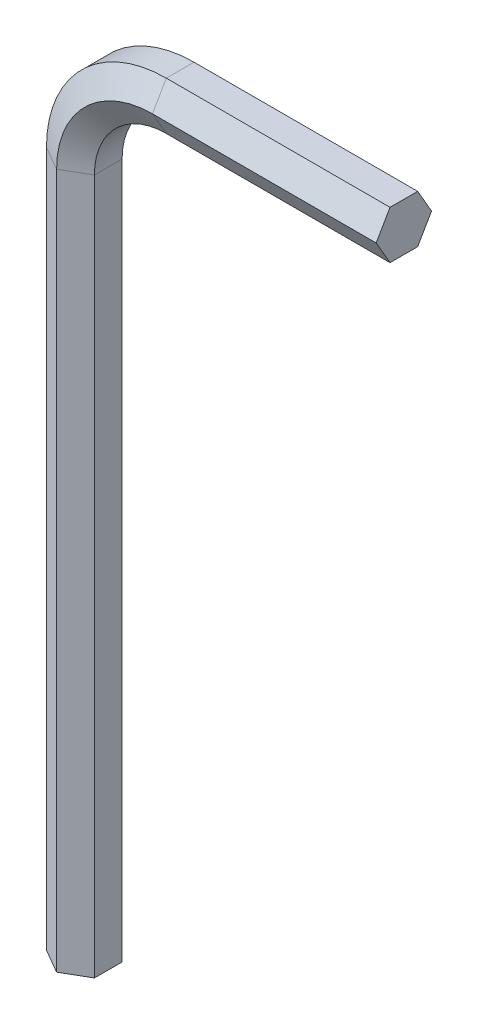
ISO-10303-21;
HEADER;
FILE_DESCRIPTION(('STEP AP214'),'2;1');
FILE_NAME('part.step','',(''),(''),'','','');
FILE_SCHEMA(('AUTOMOTIVE_DESIGN { 1 0 10303 214 1 1 1 1 }'));
ENDSEC;
DATA;
#1=APPLICATION_CONTEXT('core data for automotive mechanical design processes');
#2=APPLICATION_PROTOCOL_DEFINITION('international standard','automotive_design',2000,#1);
#3=PRODUCT_CONTEXT('',#1,'mechanical');
#4=PRODUCT('Part','Part','',(#3));
#5=PRODUCT_RELATED_PRODUCT_CATEGORY('part','',(#4));
#6=PRODUCT_DEFINITION_FORMATION('','',#4);
#7=PRODUCT_DEFINITION_CONTEXT('part definition',#1,'design');
#8=PRODUCT_DEFINITION('design','',#6,#7);
#9=PRODUCT_DEFINITION_SHAPE('','',#8);
#10=(LENGTH_UNIT() NAMED_UNIT(*) SI_UNIT(.MILLI.,.METRE.));
#11=(NAMED_UNIT(*) PLANE_ANGLE_UNIT() SI_UNIT($,.RADIAN.));
#12=(NAMED_UNIT(*) SI_UNIT($,.STERADIAN.) SOLID_ANGLE_UNIT());
#13=UNCERTAINTY_MEASURE_WITH_UNIT(LENGTH_MEASURE(1.E-05),#10,'distance_accuracy_value','');
#14=(GEOMETRIC_REPRESENTATION_CONTEXT(3) GLOBAL_UNCERTAINTY_ASSIGNED_CONTEXT((#13)) GLOBAL_UNIT_ASSIGNED_CONTEXT((#10,
#11,#12)) REPRESENTATION_CONTEXT('',''));
#15=CARTESIAN_POINT('',(0.,0.,0.));
#16=DIRECTION('',(0.,0.,1.));
#17=DIRECTION('',(1.,0.,0.));
#18=AXIS2_PLACEMENT_3D('',#15,#16,#17);
#19=CARTESIAN_POINT('',(-5.75291016450414,0.,0.));
#20=DIRECTION('',(1.,0.,0.));
#21=DIRECTION('',(0.,0.,1.));
#22=AXIS2_PLACEMENT_3D('',#19,#20,#21);
#23=PLANE('',#22);
#24=DIRECTION('',(0.,0.866025403784439,-0.5));
#25=VECTOR('',#24,1.);
#26=CARTESIAN_POINT('',(-5.75291016450414,29.2479101645041,-1.09985226280624));
#27=LINE('',#26,#25);
#28=CARTESIAN_POINT('',(-5.75291016450414,29.2479101645041,-1.09985226280624));
#29=VERTEX_POINT('',#28);
#30=CARTESIAN_POINT('',(-5.75291016450414,31.1529101645041,-2.19970452561248));
#31=VERTEX_POINT('',#30);
#32=EDGE_CURVE('E189',#29,#31,#27,.T.);
#33=ORIENTED_EDGE('',*,*,#32,.T.);
#34=DIRECTION('',(0.,0.866025403784439,0.5));
#35=VECTOR('',#34,1.);
#36=CARTESIAN_POINT('',(-5.75291016450414,31.1529101645041,-2.19970452561248));
#37=LINE('',#36,#35);
#38=CARTESIAN_POINT('',(-5.75291016450414,33.0579101645041,-1.09985226280624));
#39=VERTEX_POINT('',#38);
#40=EDGE_CURVE('E147',#31,#39,#37,.T.);
#41=ORIENTED_EDGE('',*,*,#40,.T.);
#42=DIRECTION('',(0.,0.,1.));
#43=VECTOR('',#42,1.);
#44=CARTESIAN_POINT('',(-5.75291016450414,33.0579101645041,-1.09985226280624));
#45=LINE('',#44,#43);
#46=CARTESIAN_POINT('',(-5.75291016450414,33.0579101645041,1.09985226280623));
#47=VERTEX_POINT('',#46);
#48=EDGE_CURVE('E139',#39,#47,#45,.T.);
#49=ORIENTED_EDGE('',*,*,#48,.T.);
#50=DIRECTION('',(0.,-0.866025403784439,0.5));
#51=VECTOR('',#50,1.);
#52=CARTESIAN_POINT('',(-5.75291016450414,33.0579101645041,1.09985226280623));
#53=LINE('',#52,#51);
#54=CARTESIAN_POINT('',(-5.75291016450414,31.1529101645041,2.19970452561248));
#55=VERTEX_POINT('',#54);
#56=EDGE_CURVE('E132',#47,#55,#53,.T.);
#57=ORIENTED_EDGE('',*,*,#56,.T.);
#58=DIRECTION('',(0.,-0.866025403784438,-0.5));
#59=VECTOR('',#58,1.);
#60=CARTESIAN_POINT('',(-5.75291016450414,31.1529101645041,2.19970452561248));
#61=LINE('',#60,#59);
#62=CARTESIAN_POINT('',(-5.75291016450414,29.2479101645041,1.09985226280624));
#63=VERTEX_POINT('',#62);
#64=EDGE_CURVE('E213',#55,#63,#61,.T.);
#65=ORIENTED_EDGE('',*,*,#64,.T.);
#66=DIRECTION('',(0.,0.,-1.));
#67=VECTOR('',#66,1.);
#68=CARTESIAN_POINT('',(-5.75291016450414,29.2479101645041,1.09985226280624));
#69=LINE('',#68,#67);
#70=EDGE_CURVE('E227',#63,#29,#69,.T.);
#71=ORIENTED_EDGE('',*,*,#70,.T.);
#72=EDGE_LOOP('',(#33,#41,#49,#57,#65,#71));
#73=FACE_BOUND('',#72,.T.);
#74=ADVANCED_FACE('F33',(#73),#23,.T.);
#75=CARTESIAN_POINT('',(0.,-31.7352075507565,0.));
#76=DIRECTION('',(0.,1.,0.));
#77=DIRECTION('',(0.,0.,1.));
#78=AXIS2_PLACEMENT_3D('',#75,#76,#77);
#79=PLANE('',#78);
#80=DIRECTION('',(-0.866025403784439,0.,-0.5));
#81=VECTOR('',#80,1.);
#82=CARTESIAN_POINT('',(-29.2479101645041,-31.7352075507565,-1.09985226280624));
#83=LINE('',#82,#81);
#84=CARTESIAN_POINT('',(-29.2479101645041,-31.7352075507565,-1.09985226280624));
#85=VERTEX_POINT('',#84);
#86=CARTESIAN_POINT('',(-31.1529101645041,-31.7352075507565,-2.19970452561248));
#87=VERTEX_POINT('',#86);
#88=EDGE_CURVE('E161',#85,#87,#83,.T.);
#89=ORIENTED_EDGE('',*,*,#88,.F.);
#90=DIRECTION('',(0.,0.,-1.));
#91=VECTOR('',#90,1.);
#92=CARTESIAN_POINT('',(-29.2479101645041,-31.7352075507565,1.09985226280624));
#93=LINE('',#92,#91);
#94=CARTESIAN_POINT('',(-29.2479101645041,-31.7352075507565,1.09985226280624));
#95=VERTEX_POINT('',#94);
#96=EDGE_CURVE('E11',#95,#85,#93,.T.);
#97=ORIENTED_EDGE('',*,*,#96,.F.);
#98=DIRECTION('',(0.866025403784438,0.,-0.5));
#99=VECTOR('',#98,1.);
#100=CARTESIAN_POINT('',(-31.1529101645041,-31.7352075507565,2.19970452561248));
#101=LINE('',#100,#99);
#102=CARTESIAN_POINT('',(-31.1529101645041,-31.7352075507565,2.19970452561248));
#103=VERTEX_POINT('',#102);
#104=EDGE_CURVE('E40',#103,#95,#101,.T.);
#105=ORIENTED_EDGE('',*,*,#104,.F.);
#106=DIRECTION('',(0.866025403784439,0.,0.5));
#107=VECTOR('',#106,1.);
#108=CARTESIAN_POINT('',(-33.0579101645041,-31.7352075507565,1.09985226280623));
#109=LINE('',#108,#107);
#110=CARTESIAN_POINT('',(-33.0579101645041,-31.7352075507565,1.09985226280623));
#111=VERTEX_POINT('',#110);
#112=EDGE_CURVE('E55',#111,#103,#109,.T.);
#113=ORIENTED_EDGE('',*,*,#112,.F.);
#114=DIRECTION('',(0.,0.,1.));
#115=VECTOR('',#114,1.);
#116=CARTESIAN_POINT('',(-33.0579101645041,-31.7352075507565,-1.09985226280624));
#117=LINE('',#116,#115);
#118=CARTESIAN_POINT('',(-33.0579101645041,-31.7352075507565,-1.09985226280624));
#119=VERTEX_POINT('',#118);
#120=EDGE_CURVE('E174',#119,#111,#117,.T.);
#121=ORIENTED_EDGE('',*,*,#120,.F.);
#122=DIRECTION('',(-0.866025403784439,0.,0.5));
#123=VECTOR('',#122,1.);
#124=CARTESIAN_POINT('',(-31.1529101645041,-31.7352075507565,-2.19970452561248));
#125=LINE('',#124,#123);
#126=EDGE_CURVE('E170',#87,#119,#125,.T.);
#127=ORIENTED_EDGE('',*,*,#126,.F.);
#128=EDGE_LOOP('',(#89,#97,#105,#113,#121,#127));
#129=FACE_BOUND('',#128,.T.);
#130=ADVANCED_FACE('F173',(#129),#79,.F.);
#131=CARTESIAN_POINT('',(-5.75291016450414,29.2479101645041,-1.09985226280624));
#132=DIRECTION('',(0.,0.5,0.866025403784439));
#133=DIRECTION('',(0.,-0.866025403784438,0.5));
#134=AXIS2_PLACEMENT_3D('',#131,#132,#133);
#135=PLANE('',#134);
#136=DIRECTION('',(-1.,0.,0.));
#137=VECTOR('',#136,1.);
#138=CARTESIAN_POINT('',(-5.75291016450414,31.1529101645041,-2.19970452561248));
#139=LINE('',#138,#137);
#140=CARTESIAN_POINT('',(-23.5329101645041,31.1529101645041,-2.19970452561248));
#141=VERTEX_POINT('',#140);
#142=EDGE_CURVE('E194',#31,#141,#139,.T.);
#143=ORIENTED_EDGE('',*,*,#142,.F.);
#144=ORIENTED_EDGE('',*,*,#32,.F.);
#145=DIRECTION('',(-1.,0.,0.));
#146=VECTOR('',#145,1.);
#147=CARTESIAN_POINT('',(-5.75291016450414,29.2479101645041,-1.09985226280624));
#148=LINE('',#147,#146);
#149=CARTESIAN_POINT('',(-23.5329101645041,29.2479101645041,-1.09985226280624));
#150=VERTEX_POINT('',#149);
#151=EDGE_CURVE('E243',#29,#150,#148,.T.);
#152=ORIENTED_EDGE('',*,*,#151,.T.);
#153=DIRECTION('',(0.,0.866025403784439,-0.5));
#154=VECTOR('',#153,1.);
#155=CARTESIAN_POINT('',(-23.5329101645041,29.2479101645041,-1.09985226280624));
#156=LINE('',#155,#154);
#157=EDGE_CURVE('E259',#150,#141,#156,.T.);
#158=ORIENTED_EDGE('',*,*,#157,.T.);
#159=EDGE_LOOP('',(#143,#144,#152,#158));
#160=FACE_BOUND('',#159,.T.);
#161=ADVANCED_FACE('F270',(#160),#135,.F.);
#162=CARTESIAN_POINT('',(-5.75291016450414,31.1529101645041,-2.19970452561248));
#163=DIRECTION('',(0.,-0.5,0.866025403784439));
#164=DIRECTION('',(0.,-0.866025403784439,-0.5));
#165=AXIS2_PLACEMENT_3D('',#162,#163,#164);
#166=PLANE('',#165);
#167=DIRECTION('',(-1.,0.,0.));
#168=VECTOR('',#167,1.);
#169=CARTESIAN_POINT('',(-5.75291016450414,33.0579101645041,-1.09985226280624));
#170=LINE('',#169,#168);
#171=CARTESIAN_POINT('',(-23.5329101645041,33.0579101645041,-1.09985226280624));
#172=VERTEX_POINT('',#171);
#173=EDGE_CURVE('E193',#39,#172,#170,.T.);
#174=ORIENTED_EDGE('',*,*,#173,.F.);
#175=ORIENTED_EDGE('',*,*,#40,.F.);
#176=ORIENTED_EDGE('',*,*,#142,.T.);
#177=DIRECTION('',(0.,0.866025403784439,0.5));
#178=VECTOR('',#177,1.);
#179=CARTESIAN_POINT('',(-23.5329101645041,31.1529101645041,-2.19970452561248));
#180=LINE('',#179,#178);
#181=EDGE_CURVE('E190',#141,#172,#180,.T.);
#182=ORIENTED_EDGE('',*,*,#181,.T.);
#183=EDGE_LOOP('',(#174,#175,#176,#182));
#184=FACE_BOUND('',#183,.T.);
#185=ADVANCED_FACE('F271',(#184),#166,.F.);
#186=CARTESIAN_POINT('',(-5.75291016450414,33.0579101645041,-1.09985226280624));
#187=DIRECTION('',(0.,-1.,0.));
#188=DIRECTION('',(0.,0.,-1.));
#189=AXIS2_PLACEMENT_3D('',#186,#187,#188);
#190=PLANE('',#189);
#191=DIRECTION('',(-1.,0.,0.));
#192=VECTOR('',#191,1.);
#193=CARTESIAN_POINT('',(-5.75291016450414,33.0579101645041,1.09985226280623));
#194=LINE('',#193,#192);
#195=CARTESIAN_POINT('',(-23.5329101645041,33.0579101645041,1.09985226280623));
#196=VERTEX_POINT('',#195);
#197=EDGE_CURVE('E204',#47,#196,#194,.T.);
#198=ORIENTED_EDGE('',*,*,#197,.F.);
#199=ORIENTED_EDGE('',*,*,#48,.F.);
#200=ORIENTED_EDGE('',*,*,#173,.T.);
#201=DIRECTION('',(0.,0.,1.));
#202=VECTOR('',#201,1.);
#203=CARTESIAN_POINT('',(-23.5329101645041,33.0579101645041,-1.09985226280624));
#204=LINE('',#203,#202);
#205=EDGE_CURVE('E196',#172,#196,#204,.T.);
#206=ORIENTED_EDGE('',*,*,#205,.T.);
#207=EDGE_LOOP('',(#198,#199,#200,#206));
#208=FACE_BOUND('',#207,.T.);
#209=ADVANCED_FACE('F324',(#208),#190,.F.);
#210=CARTESIAN_POINT('',(-5.75291016450414,33.0579101645041,1.09985226280623));
#211=DIRECTION('',(0.,-0.5,-0.866025403784439));
#212=DIRECTION('',(0.,0.866025403784439,-0.5));
#213=AXIS2_PLACEMENT_3D('',#210,#211,#212);
#214=PLANE('',#213);
#215=DIRECTION('',(-1.,0.,0.));
#216=VECTOR('',#215,1.);
#217=CARTESIAN_POINT('',(-5.75291016450414,31.1529101645041,2.19970452561248));
#218=LINE('',#217,#216);
#219=CARTESIAN_POINT('',(-23.5329101645041,31.1529101645041,2.19970452561248));
#220=VERTEX_POINT('',#219);
#221=EDGE_CURVE('E216',#55,#220,#218,.T.);
#222=ORIENTED_EDGE('',*,*,#221,.F.);
#223=ORIENTED_EDGE('',*,*,#56,.F.);
#224=ORIENTED_EDGE('',*,*,#197,.T.);
#225=DIRECTION('',(0.,-0.866025403784439,0.5));
#226=VECTOR('',#225,1.);
#227=CARTESIAN_POINT('',(-23.5329101645041,33.0579101645041,1.09985226280623));
#228=LINE('',#227,#226);
#229=EDGE_CURVE('E206',#196,#220,#228,.T.);
#230=ORIENTED_EDGE('',*,*,#229,.T.);
#231=EDGE_LOOP('',(#222,#223,#224,#230));
#232=FACE_BOUND('',#231,.T.);
#233=ADVANCED_FACE('F332',(#232),#214,.F.);
#234=CARTESIAN_POINT('',(-5.75291016450414,31.1529101645041,2.19970452561248));
#235=DIRECTION('',(0.,0.500000000000001,-0.866025403784438));
#236=DIRECTION('',(0.,0.866025403784438,0.500000000000001));
#237=AXIS2_PLACEMENT_3D('',#234,#235,#236);
#238=PLANE('',#237);
#239=DIRECTION('',(-1.,0.,0.));
#240=VECTOR('',#239,1.);
#241=CARTESIAN_POINT('',(-5.75291016450414,29.2479101645041,1.09985226280624));
#242=LINE('',#241,#240);
#243=CARTESIAN_POINT('',(-23.5329101645041,29.2479101645041,1.09985226280624));
#244=VERTEX_POINT('',#243);
#245=EDGE_CURVE('E230',#63,#244,#242,.T.);
#246=ORIENTED_EDGE('',*,*,#245,.F.);
#247=ORIENTED_EDGE('',*,*,#64,.F.);
#248=ORIENTED_EDGE('',*,*,#221,.T.);
#249=DIRECTION('',(0.,-0.866025403784438,-0.5));
#250=VECTOR('',#249,1.);
#251=CARTESIAN_POINT('',(-23.5329101645041,31.1529101645041,2.19970452561248));
#252=LINE('',#251,#250);
#253=EDGE_CURVE('E219',#220,#244,#252,.T.);
#254=ORIENTED_EDGE('',*,*,#253,.T.);
#255=EDGE_LOOP('',(#246,#247,#248,#254));
#256=FACE_BOUND('',#255,.T.);
#257=ADVANCED_FACE('F341',(#256),#238,.F.);
#258=CARTESIAN_POINT('',(-5.75291016450414,29.2479101645041,1.09985226280624));
#259=DIRECTION('',(0.,1.,0.));
#260=DIRECTION('',(0.,0.,1.));
#261=AXIS2_PLACEMENT_3D('',#258,#259,#260);
#262=PLANE('',#261);
#263=DIRECTION('',(0.,0.,-1.));
#264=VECTOR('',#263,1.);
#265=CARTESIAN_POINT('',(-23.5329101645041,29.2479101645041,1.09985226280624));
#266=LINE('',#265,#264);
#267=EDGE_CURVE('E233',#244,#150,#266,.T.);
#268=ORIENTED_EDGE('',*,*,#267,.T.);
#269=ORIENTED_EDGE('',*,*,#151,.F.);
#270=ORIENTED_EDGE('',*,*,#70,.F.);
#271=ORIENTED_EDGE('',*,*,#245,.T.);
#272=EDGE_LOOP('',(#268,#269,#270,#271));
#273=FACE_BOUND('',#272,.T.);
#274=ADVANCED_FACE('F282',(#273),#262,.F.);
#275=CARTESIAN_POINT('',(-23.5329101645041,23.5329101645041,-1.09985226280624));
#276=DIRECTION('',(0.,0.,-1.));
#277=DIRECTION('',(-1.,0.,0.));
#278=AXIS2_PLACEMENT_3D('',#275,#276,#277);
#279=CONICAL_SURFACE('',#278,5.71499999999999,1.0471975511966);
#280=CARTESIAN_POINT('',(-23.5329101645041,23.5329101645041,-2.19970452561248));
#281=DIRECTION('',(0.,0.,1.));
#282=DIRECTION('',(0.,1.,0.));
#283=AXIS2_PLACEMENT_3D('',#280,#281,#282);
#284=CIRCLE('',#283,7.61999999999999);
#285=CARTESIAN_POINT('',(-31.1529101645041,23.5329101645041,-2.19970452561248));
#286=VERTEX_POINT('',#285);
#287=EDGE_CURVE('E198',#141,#286,#284,.T.);
#288=ORIENTED_EDGE('',*,*,#287,.F.);
#289=ORIENTED_EDGE('',*,*,#157,.F.);
#290=CARTESIAN_POINT('',(-23.5329101645041,23.5329101645041,-1.09985226280624));
#291=DIRECTION('',(0.,0.,1.));
#292=DIRECTION('',(0.,1.,0.));
#293=AXIS2_PLACEMENT_3D('',#290,#291,#292);
#294=CIRCLE('',#293,5.71499999999999);
#295=CARTESIAN_POINT('',(-29.2479101645041,23.5329101645041,-1.09985226280624));
#296=VERTEX_POINT('',#295);
#297=EDGE_CURVE('E245',#150,#296,#294,.T.);
#298=ORIENTED_EDGE('',*,*,#297,.T.);
#299=DIRECTION('',(-0.866025403784439,0.,-0.5));
#300=VECTOR('',#299,1.);
#301=CARTESIAN_POINT('',(-29.2479101645041,23.5329101645041,-1.09985226280624));
#302=LINE('',#301,#300);
#303=EDGE_CURVE('E253',#296,#286,#302,.T.);
#304=ORIENTED_EDGE('',*,*,#303,.T.);
#305=EDGE_LOOP('',(#288,#289,#298,#304));
#306=FACE_BOUND('',#305,.T.);
#307=ADVANCED_FACE('F257',(#306),#279,.F.);
#308=CARTESIAN_POINT('',(-23.5329101645041,23.5329101645041,-2.19970452561248));
#309=DIRECTION('',(0.,0.,1.));
#310=DIRECTION('',(1.,0.,0.));
#311=AXIS2_PLACEMENT_3D('',#308,#309,#310);
#312=CONICAL_SURFACE('',#311,7.61999999999999,1.0471975511966);
#313=CARTESIAN_POINT('',(-23.5329101645041,23.5329101645041,-1.09985226280624));
#314=DIRECTION('',(0.,0.,1.));
#315=DIRECTION('',(0.,1.,0.));
#316=AXIS2_PLACEMENT_3D('',#313,#314,#315);
#317=CIRCLE('',#316,9.525);
#318=CARTESIAN_POINT('',(-33.0579101645041,23.5329101645041,-1.09985226280624));
#319=VERTEX_POINT('',#318);
#320=EDGE_CURVE('E119',#172,#319,#317,.T.);
#321=ORIENTED_EDGE('',*,*,#320,.F.);
#322=ORIENTED_EDGE('',*,*,#181,.F.);
#323=ORIENTED_EDGE('',*,*,#287,.T.);
#324=DIRECTION('',(-0.866025403784439,0.,0.5));
#325=VECTOR('',#324,1.);
#326=CARTESIAN_POINT('',(-31.1529101645041,23.5329101645041,-2.19970452561248));
#327=LINE('',#326,#325);
#328=EDGE_CURVE('E179',#286,#319,#327,.T.);
#329=ORIENTED_EDGE('',*,*,#328,.T.);
#330=EDGE_LOOP('',(#321,#322,#323,#329));
#331=FACE_BOUND('',#330,.T.);
#332=ADVANCED_FACE('F272',(#331),#312,.T.);
#333=CARTESIAN_POINT('',(-23.5329101645041,23.5329101645041,0.));
#334=DIRECTION('',(0.,0.,1.));
#335=DIRECTION('',(1.,0.,0.));
#336=AXIS2_PLACEMENT_3D('',#333,#334,#335);
#337=CYLINDRICAL_SURFACE('',#336,9.525);
#338=CARTESIAN_POINT('',(-23.5329101645041,23.5329101645041,1.09985226280623));
#339=DIRECTION('',(0.,0.,1.));
#340=DIRECTION('',(0.,1.,0.));
#341=AXIS2_PLACEMENT_3D('',#338,#339,#340);
#342=CIRCLE('',#341,9.525);
#343=CARTESIAN_POINT('',(-33.0579101645041,23.5329101645041,1.09985226280623));
#344=VERTEX_POINT('',#343);
#345=EDGE_CURVE('E111',#196,#344,#342,.T.);
#346=ORIENTED_EDGE('',*,*,#345,.F.);
#347=ORIENTED_EDGE('',*,*,#205,.F.);
#348=ORIENTED_EDGE('',*,*,#320,.T.);
#349=DIRECTION('',(0.,0.,1.));
#350=VECTOR('',#349,1.);
#351=CARTESIAN_POINT('',(-33.0579101645041,23.5329101645041,-1.09985226280624));
#352=LINE('',#351,#350);
#353=EDGE_CURVE('E199',#319,#344,#352,.T.);
#354=ORIENTED_EDGE('',*,*,#353,.T.);
#355=EDGE_LOOP('',(#346,#347,#348,#354));
#356=FACE_BOUND('',#355,.T.);
#357=ADVANCED_FACE('F274',(#356),#337,.T.);
#358=CARTESIAN_POINT('',(-23.5329101645041,23.5329101645041,1.09985226280623));
#359=DIRECTION('',(0.,0.,-1.));
#360=DIRECTION('',(-1.,0.,0.));
#361=AXIS2_PLACEMENT_3D('',#358,#359,#360);
#362=CONICAL_SURFACE('',#361,9.525,1.0471975511966);
#363=CARTESIAN_POINT('',(-23.5329101645041,23.5329101645041,2.19970452561248));
#364=DIRECTION('',(0.,0.,1.));
#365=DIRECTION('',(0.,1.,0.));
#366=AXIS2_PLACEMENT_3D('',#363,#364,#365);
#367=CIRCLE('',#366,7.61999999999999);
#368=CARTESIAN_POINT('',(-31.1529101645041,23.5329101645041,2.19970452561248));
#369=VERTEX_POINT('',#368);
#370=EDGE_CURVE('E103',#220,#369,#367,.T.);
#371=ORIENTED_EDGE('',*,*,#370,.F.);
#372=ORIENTED_EDGE('',*,*,#229,.F.);
#373=ORIENTED_EDGE('',*,*,#345,.T.);
#374=DIRECTION('',(0.866025403784439,0.,0.5));
#375=VECTOR('',#374,1.);
#376=CARTESIAN_POINT('',(-33.0579101645041,23.5329101645041,1.09985226280623));
#377=LINE('',#376,#375);
#378=EDGE_CURVE('E209',#344,#369,#377,.T.);
#379=ORIENTED_EDGE('',*,*,#378,.T.);
#380=EDGE_LOOP('',(#371,#372,#373,#379));
#381=FACE_BOUND('',#380,.T.);
#382=ADVANCED_FACE('F280',(#381),#362,.T.);
#383=CARTESIAN_POINT('',(-23.5329101645041,23.5329101645041,2.19970452561248));
#384=DIRECTION('',(0.,0.,1.));
#385=DIRECTION('',(1.,0.,0.));
#386=AXIS2_PLACEMENT_3D('',#383,#384,#385);
#387=CONICAL_SURFACE('',#386,7.61999999999999,1.0471975511966);
#388=CARTESIAN_POINT('',(-23.5329101645041,23.5329101645041,1.09985226280624));
#389=DIRECTION('',(0.,0.,1.));
#390=DIRECTION('',(0.,1.,0.));
#391=AXIS2_PLACEMENT_3D('',#388,#389,#390);
#392=CIRCLE('',#391,5.71499999999999);
#393=CARTESIAN_POINT('',(-29.2479101645041,23.5329101645041,1.09985226280624));
#394=VERTEX_POINT('',#393);
#395=EDGE_CURVE('E236',#244,#394,#392,.T.);
#396=ORIENTED_EDGE('',*,*,#395,.F.);
#397=ORIENTED_EDGE('',*,*,#253,.F.);
#398=ORIENTED_EDGE('',*,*,#370,.T.);
#399=DIRECTION('',(0.866025403784438,0.,-0.5));
#400=VECTOR('',#399,1.);
#401=CARTESIAN_POINT('',(-31.1529101645041,23.5329101645041,2.19970452561248));
#402=LINE('',#401,#400);
#403=EDGE_CURVE('E222',#369,#394,#402,.T.);
#404=ORIENTED_EDGE('',*,*,#403,.T.);
#405=EDGE_LOOP('',(#396,#397,#398,#404));
#406=FACE_BOUND('',#405,.T.);
#407=ADVANCED_FACE('F383',(#406),#387,.F.);
#408=CARTESIAN_POINT('',(-23.5329101645041,23.5329101645041,0.));
#409=DIRECTION('',(0.,0.,1.));
#410=DIRECTION('',(1.,0.,0.));
#411=AXIS2_PLACEMENT_3D('',#408,#409,#410);
#412=CYLINDRICAL_SURFACE('',#411,5.71499999999999);
#413=DIRECTION('',(0.,0.,-1.));
#414=VECTOR('',#413,1.);
#415=CARTESIAN_POINT('',(-29.2479101645041,23.5329101645041,1.09985226280624));
#416=LINE('',#415,#414);
#417=EDGE_CURVE('E184',#394,#296,#416,.T.);
#418=ORIENTED_EDGE('',*,*,#417,.T.);
#419=ORIENTED_EDGE('',*,*,#297,.F.);
#420=ORIENTED_EDGE('',*,*,#267,.F.);
#421=ORIENTED_EDGE('',*,*,#395,.T.);
#422=EDGE_LOOP('',(#418,#419,#420,#421));
#423=FACE_BOUND('',#422,.T.);
#424=ADVANCED_FACE('F248',(#423),#412,.F.);
#425=CARTESIAN_POINT('',(-29.2479101645041,23.5329101645041,-1.09985226280624));
#426=DIRECTION('',(-0.5,0.,0.866025403784439));
#427=DIRECTION('',(0.866025403784439,0.,0.5));
#428=AXIS2_PLACEMENT_3D('',#425,#426,#427);
#429=PLANE('',#428);
#430=DIRECTION('',(0.,-1.,0.));
#431=VECTOR('',#430,1.);
#432=CARTESIAN_POINT('',(-31.1529101645041,23.5329101645041,-2.19970452561248));
#433=LINE('',#432,#431);
#434=EDGE_CURVE('E166',#286,#87,#433,.T.);
#435=ORIENTED_EDGE('',*,*,#434,.F.);
#436=ORIENTED_EDGE('',*,*,#303,.F.);
#437=DIRECTION('',(0.,-1.,0.));
#438=VECTOR('',#437,1.);
#439=CARTESIAN_POINT('',(-29.2479101645041,23.5329101645041,-1.09985226280624));
#440=LINE('',#439,#438);
#441=EDGE_CURVE('E168',#296,#85,#440,.T.);
#442=ORIENTED_EDGE('',*,*,#441,.T.);
#443=ORIENTED_EDGE('',*,*,#88,.T.);
#444=EDGE_LOOP('',(#435,#436,#442,#443));
#445=FACE_BOUND('',#444,.T.);
#446=ADVANCED_FACE('F163',(#445),#429,.F.);
#447=CARTESIAN_POINT('',(-31.1529101645041,23.5329101645041,-2.19970452561248));
#448=DIRECTION('',(0.5,0.,0.866025403784439));
#449=DIRECTION('',(0.866025403784439,0.,-0.5));
#450=AXIS2_PLACEMENT_3D('',#447,#448,#449);
#451=PLANE('',#450);
#452=DIRECTION('',(0.,-1.,0.));
#453=VECTOR('',#452,1.);
#454=CARTESIAN_POINT('',(-33.0579101645041,23.5329101645041,-1.09985226280624));
#455=LINE('',#454,#453);
#456=EDGE_CURVE('E181',#319,#119,#455,.T.);
#457=ORIENTED_EDGE('',*,*,#456,.F.);
#458=ORIENTED_EDGE('',*,*,#328,.F.);
#459=ORIENTED_EDGE('',*,*,#434,.T.);
#460=ORIENTED_EDGE('',*,*,#126,.T.);
#461=EDGE_LOOP('',(#457,#458,#459,#460));
#462=FACE_BOUND('',#461,.T.);
#463=ADVANCED_FACE('F178',(#462),#451,.F.);
#464=CARTESIAN_POINT('',(-33.0579101645041,23.5329101645041,-1.09985226280624));
#465=DIRECTION('',(1.,0.,0.));
#466=DIRECTION('',(0.,0.,-1.));
#467=AXIS2_PLACEMENT_3D('',#464,#465,#466);
#468=PLANE('',#467);
#469=DIRECTION('',(0.,-1.,0.));
#470=VECTOR('',#469,1.);
#471=CARTESIAN_POINT('',(-33.0579101645041,23.5329101645041,1.09985226280623));
#472=LINE('',#471,#470);
#473=EDGE_CURVE('E88',#344,#111,#472,.T.);
#474=ORIENTED_EDGE('',*,*,#473,.F.);
#475=ORIENTED_EDGE('',*,*,#353,.F.);
#476=ORIENTED_EDGE('',*,*,#456,.T.);
#477=ORIENTED_EDGE('',*,*,#120,.T.);
#478=EDGE_LOOP('',(#474,#475,#476,#477));
#479=FACE_BOUND('',#478,.T.);
#480=ADVANCED_FACE('F416',(#479),#468,.F.);
#481=CARTESIAN_POINT('',(-33.0579101645041,23.5329101645041,1.09985226280623));
#482=DIRECTION('',(0.5,0.,-0.866025403784439));
#483=DIRECTION('',(-0.866025403784439,0.,-0.5));
#484=AXIS2_PLACEMENT_3D('',#481,#482,#483);
#485=PLANE('',#484);
#486=DIRECTION('',(0.,-1.,0.));
#487=VECTOR('',#486,1.);
#488=CARTESIAN_POINT('',(-31.1529101645041,23.5329101645041,2.19970452561248));
#489=LINE('',#488,#487);
#490=EDGE_CURVE('E82',#369,#103,#489,.T.);
#491=ORIENTED_EDGE('',*,*,#490,.F.);
#492=ORIENTED_EDGE('',*,*,#378,.F.);
#493=ORIENTED_EDGE('',*,*,#473,.T.);
#494=ORIENTED_EDGE('',*,*,#112,.T.);
#495=EDGE_LOOP('',(#491,#492,#493,#494));
#496=FACE_BOUND('',#495,.T.);
#497=ADVANCED_FACE('F293',(#496),#485,.F.);
#498=CARTESIAN_POINT('',(-31.1529101645041,23.5329101645041,2.19970452561248));
#499=DIRECTION('',(-0.5,0.,-0.866025403784438));
#500=DIRECTION('',(-0.866025403784438,0.,0.5));
#501=AXIS2_PLACEMENT_3D('',#498,#499,#500);
#502=PLANE('',#501);
#503=DIRECTION('',(0.,-1.,0.));
#504=VECTOR('',#503,1.);
#505=CARTESIAN_POINT('',(-29.2479101645041,23.5329101645041,1.09985226280624));
#506=LINE('',#505,#504);
#507=EDGE_CURVE('E76',#394,#95,#506,.T.);
#508=ORIENTED_EDGE('',*,*,#507,.F.);
#509=ORIENTED_EDGE('',*,*,#403,.F.);
#510=ORIENTED_EDGE('',*,*,#490,.T.);
#511=ORIENTED_EDGE('',*,*,#104,.T.);
#512=EDGE_LOOP('',(#508,#509,#510,#511));
#513=FACE_BOUND('',#512,.T.);
#514=ADVANCED_FACE('F288',(#513),#502,.F.);
#515=CARTESIAN_POINT('',(-29.2479101645041,23.5329101645041,1.09985226280624));
#516=DIRECTION('',(-1.,0.,0.));
#517=DIRECTION('',(0.,0.,1.));
#518=AXIS2_PLACEMENT_3D('',#515,#516,#517);
#519=PLANE('',#518);
#520=ORIENTED_EDGE('',*,*,#96,.T.);
#521=ORIENTED_EDGE('',*,*,#441,.F.);
#522=ORIENTED_EDGE('',*,*,#417,.F.);
#523=ORIENTED_EDGE('',*,*,#507,.T.);
#524=EDGE_LOOP('',(#520,#521,#522,#523));
#525=FACE_BOUND('',#524,.T.);
#526=ADVANCED_FACE('F286',(#525),#519,.F.);
#527=CLOSED_SHELL('',(#74,#130,#161,#185,#209,#233,#257,#274,#307,#332,#357,#382,#407,#424,#446,
#463,#480,#497,#514,#526));
#528=MANIFOLD_SOLID_BREP('B2',#527);
#529=ADVANCED_BREP_SHAPE_REPRESENTATION('',(#18,#528),#14);
#530=SHAPE_DEFINITION_REPRESENTATION(#9,#529);
ENDSEC;
END-ISO-10303-21;
